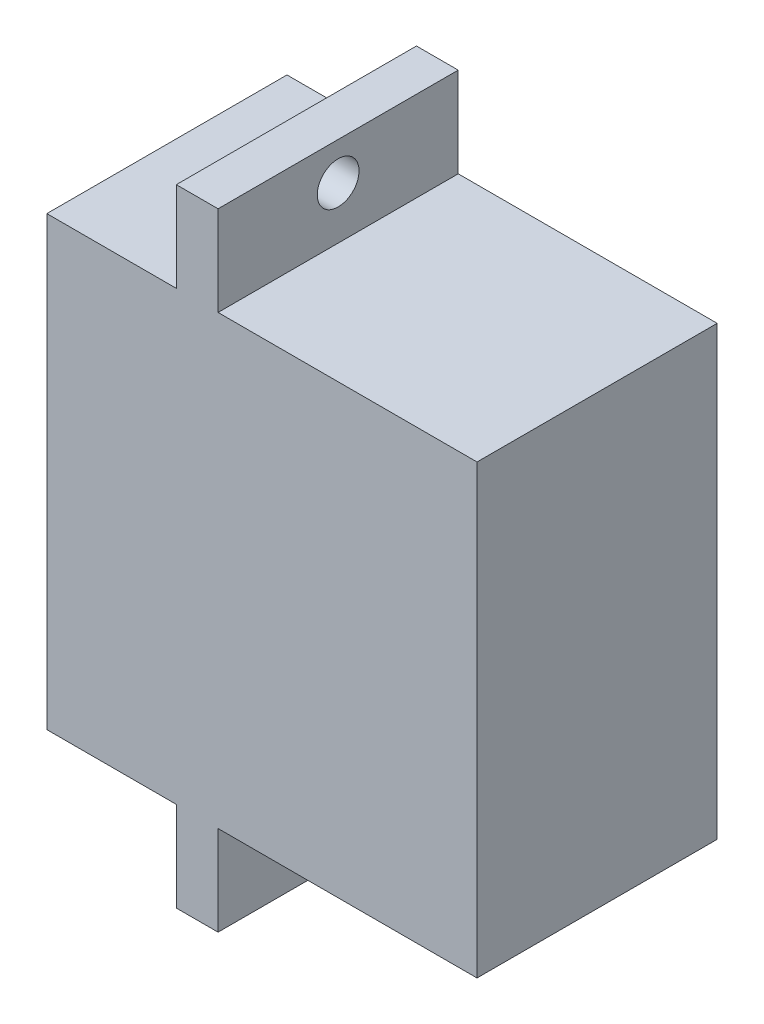
ISO-10303-21;
HEADER;
FILE_DESCRIPTION(('STEP AP214'),'2;1');
FILE_NAME('part.step','',(''),(''),'','','');
FILE_SCHEMA(('AUTOMOTIVE_DESIGN { 1 0 10303 214 1 1 1 1 }'));
ENDSEC;
DATA;
#1=APPLICATION_CONTEXT('core data for automotive mechanical design processes');
#2=APPLICATION_PROTOCOL_DEFINITION('international standard','automotive_design',2000,#1);
#3=PRODUCT_CONTEXT('',#1,'mechanical');
#4=PRODUCT('Part','Part','',(#3));
#5=PRODUCT_RELATED_PRODUCT_CATEGORY('part','',(#4));
#6=PRODUCT_DEFINITION_FORMATION('','',#4);
#7=PRODUCT_DEFINITION_CONTEXT('part definition',#1,'design');
#8=PRODUCT_DEFINITION('design','',#6,#7);
#9=PRODUCT_DEFINITION_SHAPE('','',#8);
#10=(LENGTH_UNIT() NAMED_UNIT(*) SI_UNIT(.MILLI.,.METRE.));
#11=(NAMED_UNIT(*) PLANE_ANGLE_UNIT() SI_UNIT($,.RADIAN.));
#12=(NAMED_UNIT(*) SI_UNIT($,.STERADIAN.) SOLID_ANGLE_UNIT());
#13=UNCERTAINTY_MEASURE_WITH_UNIT(LENGTH_MEASURE(1.E-05),#10,'distance_accuracy_value','');
#14=(GEOMETRIC_REPRESENTATION_CONTEXT(3) GLOBAL_UNCERTAINTY_ASSIGNED_CONTEXT((#13)) GLOBAL_UNIT_ASSIGNED_CONTEXT((#10,
#11,#12)) REPRESENTATION_CONTEXT('',''));
#15=CARTESIAN_POINT('',(0.,0.,0.));
#16=DIRECTION('',(0.,0.,1.));
#17=DIRECTION('',(1.,0.,0.));
#18=AXIS2_PLACEMENT_3D('',#15,#16,#17);
#19=CARTESIAN_POINT('',(50.4,-15.65,2.25));
#20=DIRECTION('',(0.,1.,0.));
#21=DIRECTION('',(0.,0.,1.));
#22=AXIS2_PLACEMENT_3D('',#19,#20,#21);
#23=PLANE('',#22);
#24=DIRECTION('',(0.,0.,1.));
#25=VECTOR('',#24,1.);
#26=CARTESIAN_POINT('',(38.,-15.65,2.25));
#27=LINE('',#26,#25);
#28=CARTESIAN_POINT('',(38.,-15.65,-9.25));
#29=VERTEX_POINT('',#28);
#30=CARTESIAN_POINT('',(38.,-15.65,2.25));
#31=VERTEX_POINT('',#30);
#32=EDGE_CURVE('E134',#29,#31,#27,.T.);
#33=ORIENTED_EDGE('',*,*,#32,.F.);
#34=DIRECTION('',(-1.,0.,0.));
#35=VECTOR('',#34,1.);
#36=CARTESIAN_POINT('',(50.4,-15.65,-9.25));
#37=LINE('',#36,#35);
#38=CARTESIAN_POINT('',(50.4,-15.65,-9.25));
#39=VERTEX_POINT('',#38);
#40=EDGE_CURVE('E190',#39,#29,#37,.T.);
#41=ORIENTED_EDGE('',*,*,#40,.F.);
#42=DIRECTION('',(0.,0.,-1.));
#43=VECTOR('',#42,1.);
#44=CARTESIAN_POINT('',(50.4,-15.65,2.25));
#45=LINE('',#44,#43);
#46=CARTESIAN_POINT('',(50.4,-15.65,2.25));
#47=VERTEX_POINT('',#46);
#48=EDGE_CURVE('E166',#47,#39,#45,.T.);
#49=ORIENTED_EDGE('',*,*,#48,.F.);
#50=DIRECTION('',(-1.,0.,0.));
#51=VECTOR('',#50,1.);
#52=CARTESIAN_POINT('',(50.4,-15.65,2.25));
#53=LINE('',#52,#51);
#54=EDGE_CURVE('E194',#47,#31,#53,.T.);
#55=ORIENTED_EDGE('',*,*,#54,.T.);
#56=EDGE_LOOP('',(#33,#41,#49,#55));
#57=FACE_BOUND('',#56,.T.);
#58=ADVANCED_FACE('F39',(#57),#23,.F.);
#59=CARTESIAN_POINT('',(50.4,5.75,2.25));
#60=DIRECTION('',(0.,-1.,0.));
#61=DIRECTION('',(0.,0.,-1.));
#62=AXIS2_PLACEMENT_3D('',#59,#60,#61);
#63=PLANE('',#62);
#64=DIRECTION('',(0.,0.,-1.));
#65=VECTOR('',#64,1.);
#66=CARTESIAN_POINT('',(38.,5.75,2.25));
#67=LINE('',#66,#65);
#68=CARTESIAN_POINT('',(38.,5.75,2.25));
#69=VERTEX_POINT('',#68);
#70=CARTESIAN_POINT('',(38.,5.75,-9.25));
#71=VERTEX_POINT('',#70);
#72=EDGE_CURVE('E11',#69,#71,#67,.T.);
#73=ORIENTED_EDGE('',*,*,#72,.F.);
#74=DIRECTION('',(-1.,0.,0.));
#75=VECTOR('',#74,1.);
#76=CARTESIAN_POINT('',(50.4,5.75,2.25));
#77=LINE('',#76,#75);
#78=CARTESIAN_POINT('',(50.4,5.75,2.25));
#79=VERTEX_POINT('',#78);
#80=EDGE_CURVE('E184',#79,#69,#77,.T.);
#81=ORIENTED_EDGE('',*,*,#80,.F.);
#82=DIRECTION('',(0.,0.,1.));
#83=VECTOR('',#82,1.);
#84=CARTESIAN_POINT('',(50.4,5.75,2.25));
#85=LINE('',#84,#83);
#86=CARTESIAN_POINT('',(50.4,5.75,-9.25));
#87=VERTEX_POINT('',#86);
#88=EDGE_CURVE('E171',#87,#79,#85,.T.);
#89=ORIENTED_EDGE('',*,*,#88,.F.);
#90=DIRECTION('',(-1.,0.,0.));
#91=VECTOR('',#90,1.);
#92=CARTESIAN_POINT('',(50.4,5.75,-9.25));
#93=LINE('',#92,#91);
#94=EDGE_CURVE('E62',#87,#71,#93,.T.);
#95=ORIENTED_EDGE('',*,*,#94,.T.);
#96=EDGE_LOOP('',(#73,#81,#89,#95));
#97=FACE_BOUND('',#96,.T.);
#98=ADVANCED_FACE('F246',(#97),#63,.F.);
#99=CARTESIAN_POINT('',(50.4,-15.65,2.25));
#100=DIRECTION('',(0.,0.,-1.));
#101=DIRECTION('',(-1.,0.,0.));
#102=AXIS2_PLACEMENT_3D('',#99,#100,#101);
#103=PLANE('',#102);
#104=CARTESIAN_POINT('',(36.,-15.65,2.25));
#105=VERTEX_POINT('',#104);
#106=CARTESIAN_POINT('',(29.8,-15.65,2.25));
#107=VERTEX_POINT('',#106);
#108=EDGE_CURVE('E193',#105,#107,#53,.T.);
#109=ORIENTED_EDGE('',*,*,#108,.F.);
#110=DIRECTION('',(0.,-1.,0.));
#111=VECTOR('',#110,1.);
#112=CARTESIAN_POINT('',(36.,-19.95,2.25));
#113=LINE('',#112,#111);
#114=CARTESIAN_POINT('',(36.,-19.95,2.25));
#115=VERTEX_POINT('',#114);
#116=EDGE_CURVE('E151',#105,#115,#113,.T.);
#117=ORIENTED_EDGE('',*,*,#116,.T.);
#118=DIRECTION('',(-1.,0.,0.));
#119=VECTOR('',#118,1.);
#120=CARTESIAN_POINT('',(38.,-19.95,2.25));
#121=LINE('',#120,#119);
#122=CARTESIAN_POINT('',(38.,-19.95,2.25));
#123=VERTEX_POINT('',#122);
#124=EDGE_CURVE('E145',#123,#115,#121,.T.);
#125=ORIENTED_EDGE('',*,*,#124,.F.);
#126=DIRECTION('',(0.,-1.,0.));
#127=VECTOR('',#126,1.);
#128=CARTESIAN_POINT('',(38.,-19.95,2.25));
#129=LINE('',#128,#127);
#130=EDGE_CURVE('E128',#31,#123,#129,.T.);
#131=ORIENTED_EDGE('',*,*,#130,.F.);
#132=ORIENTED_EDGE('',*,*,#54,.F.);
#133=DIRECTION('',(0.,-1.,0.));
#134=VECTOR('',#133,1.);
#135=CARTESIAN_POINT('',(50.4,-15.65,2.25));
#136=LINE('',#135,#134);
#137=EDGE_CURVE('E163',#79,#47,#136,.T.);
#138=ORIENTED_EDGE('',*,*,#137,.F.);
#139=ORIENTED_EDGE('',*,*,#80,.T.);
#140=CARTESIAN_POINT('',(38.,10.05,2.25));
#141=VERTEX_POINT('',#140);
#142=EDGE_CURVE('E139',#141,#69,#129,.T.);
#143=ORIENTED_EDGE('',*,*,#142,.F.);
#144=DIRECTION('',(-1.,0.,0.));
#145=VECTOR('',#144,1.);
#146=CARTESIAN_POINT('',(38.,10.05,2.25));
#147=LINE('',#146,#145);
#148=CARTESIAN_POINT('',(36.,10.05,2.25));
#149=VERTEX_POINT('',#148);
#150=EDGE_CURVE('E215',#141,#149,#147,.T.);
#151=ORIENTED_EDGE('',*,*,#150,.T.);
#152=CARTESIAN_POINT('',(36.,5.75,2.25));
#153=VERTEX_POINT('',#152);
#154=EDGE_CURVE('E210',#149,#153,#113,.T.);
#155=ORIENTED_EDGE('',*,*,#154,.T.);
#156=CARTESIAN_POINT('',(29.8,5.75,2.25));
#157=VERTEX_POINT('',#156);
#158=EDGE_CURVE('E173',#153,#157,#77,.T.);
#159=ORIENTED_EDGE('',*,*,#158,.T.);
#160=DIRECTION('',(0.,-1.,0.));
#161=VECTOR('',#160,1.);
#162=CARTESIAN_POINT('',(29.8,-15.65,2.25));
#163=LINE('',#162,#161);
#164=EDGE_CURVE('E162',#157,#107,#163,.T.);
#165=ORIENTED_EDGE('',*,*,#164,.T.);
#166=EDGE_LOOP('',(#109,#117,#125,#131,#132,#138,#139,#143,#151,#155,#159,#165));
#167=FACE_BOUND('',#166,.T.);
#168=ADVANCED_FACE('F41',(#167),#103,.F.);
#169=CARTESIAN_POINT('',(36.,-15.65,-9.25));
#170=VERTEX_POINT('',#169);
#171=CARTESIAN_POINT('',(29.8,-15.65,-9.25));
#172=VERTEX_POINT('',#171);
#173=EDGE_CURVE('E189',#170,#172,#37,.T.);
#174=ORIENTED_EDGE('',*,*,#173,.F.);
#175=DIRECTION('',(0.,0.,1.));
#176=VECTOR('',#175,1.);
#177=CARTESIAN_POINT('',(36.,-15.65,2.25));
#178=LINE('',#177,#176);
#179=EDGE_CURVE('E153',#170,#105,#178,.T.);
#180=ORIENTED_EDGE('',*,*,#179,.T.);
#181=ORIENTED_EDGE('',*,*,#108,.T.);
#182=DIRECTION('',(0.,0.,-1.));
#183=VECTOR('',#182,1.);
#184=CARTESIAN_POINT('',(29.8,-15.65,2.25));
#185=LINE('',#184,#183);
#186=EDGE_CURVE('E176',#107,#172,#185,.T.);
#187=ORIENTED_EDGE('',*,*,#186,.T.);
#188=EDGE_LOOP('',(#174,#180,#181,#187));
#189=FACE_BOUND('',#188,.T.);
#190=ADVANCED_FACE('F252',(#189),#23,.F.);
#191=CARTESIAN_POINT('',(50.4,-15.65,-9.25));
#192=DIRECTION('',(0.,0.,1.));
#193=DIRECTION('',(1.,0.,0.));
#194=AXIS2_PLACEMENT_3D('',#191,#192,#193);
#195=PLANE('',#194);
#196=CARTESIAN_POINT('',(36.,5.75,-9.25));
#197=VERTEX_POINT('',#196);
#198=CARTESIAN_POINT('',(29.8,5.75,-9.25));
#199=VERTEX_POINT('',#198);
#200=EDGE_CURVE('E187',#197,#199,#93,.T.);
#201=ORIENTED_EDGE('',*,*,#200,.F.);
#202=DIRECTION('',(0.,1.,0.));
#203=VECTOR('',#202,1.);
#204=CARTESIAN_POINT('',(36.,-19.95,-9.25));
#205=LINE('',#204,#203);
#206=CARTESIAN_POINT('',(36.,10.05,-9.25));
#207=VERTEX_POINT('',#206);
#208=EDGE_CURVE('E204',#197,#207,#205,.T.);
#209=ORIENTED_EDGE('',*,*,#208,.T.);
#210=DIRECTION('',(-1.,0.,0.));
#211=VECTOR('',#210,1.);
#212=CARTESIAN_POINT('',(38.,10.05,-9.25));
#213=LINE('',#212,#211);
#214=CARTESIAN_POINT('',(38.,10.05,-9.25));
#215=VERTEX_POINT('',#214);
#216=EDGE_CURVE('E157',#215,#207,#213,.T.);
#217=ORIENTED_EDGE('',*,*,#216,.F.);
#218=DIRECTION('',(0.,1.,0.));
#219=VECTOR('',#218,1.);
#220=CARTESIAN_POINT('',(38.,-19.95,-9.25));
#221=LINE('',#220,#219);
#222=EDGE_CURVE('E148',#71,#215,#221,.T.);
#223=ORIENTED_EDGE('',*,*,#222,.F.);
#224=ORIENTED_EDGE('',*,*,#94,.F.);
#225=DIRECTION('',(0.,1.,0.));
#226=VECTOR('',#225,1.);
#227=CARTESIAN_POINT('',(50.4,-15.65,-9.25));
#228=LINE('',#227,#226);
#229=EDGE_CURVE('E169',#39,#87,#228,.T.);
#230=ORIENTED_EDGE('',*,*,#229,.F.);
#231=ORIENTED_EDGE('',*,*,#40,.T.);
#232=CARTESIAN_POINT('',(38.,-19.95,-9.25));
#233=VERTEX_POINT('',#232);
#234=EDGE_CURVE('E226',#233,#29,#221,.T.);
#235=ORIENTED_EDGE('',*,*,#234,.F.);
#236=DIRECTION('',(-1.,0.,0.));
#237=VECTOR('',#236,1.);
#238=CARTESIAN_POINT('',(38.,-19.95,-9.25));
#239=LINE('',#238,#237);
#240=CARTESIAN_POINT('',(36.,-19.95,-9.25));
#241=VERTEX_POINT('',#240);
#242=EDGE_CURVE('E146',#233,#241,#239,.T.);
#243=ORIENTED_EDGE('',*,*,#242,.T.);
#244=EDGE_CURVE('E54',#241,#170,#205,.T.);
#245=ORIENTED_EDGE('',*,*,#244,.T.);
#246=ORIENTED_EDGE('',*,*,#173,.T.);
#247=DIRECTION('',(0.,1.,0.));
#248=VECTOR('',#247,1.);
#249=CARTESIAN_POINT('',(29.8,-15.65,-9.25));
#250=LINE('',#249,#248);
#251=EDGE_CURVE('E179',#172,#199,#250,.T.);
#252=ORIENTED_EDGE('',*,*,#251,.T.);
#253=EDGE_LOOP('',(#201,#209,#217,#223,#224,#230,#231,#235,#243,#245,#246,#252));
#254=FACE_BOUND('',#253,.T.);
#255=ADVANCED_FACE('F223',(#254),#195,.F.);
#256=ORIENTED_EDGE('',*,*,#158,.F.);
#257=DIRECTION('',(0.,0.,-1.));
#258=VECTOR('',#257,1.);
#259=CARTESIAN_POINT('',(36.,5.75,2.25));
#260=LINE('',#259,#258);
#261=EDGE_CURVE('E47',#153,#197,#260,.T.);
#262=ORIENTED_EDGE('',*,*,#261,.T.);
#263=ORIENTED_EDGE('',*,*,#200,.T.);
#264=DIRECTION('',(0.,0.,1.));
#265=VECTOR('',#264,1.);
#266=CARTESIAN_POINT('',(29.8,5.75,2.25));
#267=LINE('',#266,#265);
#268=EDGE_CURVE('E167',#199,#157,#267,.T.);
#269=ORIENTED_EDGE('',*,*,#268,.T.);
#270=EDGE_LOOP('',(#256,#262,#263,#269));
#271=FACE_BOUND('',#270,.T.);
#272=ADVANCED_FACE('F199',(#271),#63,.F.);
#273=CARTESIAN_POINT('',(50.4,0.,0.));
#274=DIRECTION('',(-1.,0.,0.));
#275=DIRECTION('',(0.,0.,1.));
#276=AXIS2_PLACEMENT_3D('',#273,#274,#275);
#277=PLANE('',#276);
#278=ORIENTED_EDGE('',*,*,#137,.T.);
#279=ORIENTED_EDGE('',*,*,#48,.T.);
#280=ORIENTED_EDGE('',*,*,#229,.T.);
#281=ORIENTED_EDGE('',*,*,#88,.T.);
#282=EDGE_LOOP('',(#278,#279,#280,#281));
#283=FACE_BOUND('',#282,.T.);
#284=ADVANCED_FACE('F248',(#283),#277,.F.);
#285=CARTESIAN_POINT('',(29.8,0.,0.));
#286=DIRECTION('',(-1.,0.,0.));
#287=DIRECTION('',(0.,0.,1.));
#288=AXIS2_PLACEMENT_3D('',#285,#286,#287);
#289=PLANE('',#288);
#290=CARTESIAN_POINT('',(29.8,0.,-3.5));
#291=DIRECTION('',(1.,0.,0.));
#292=DIRECTION('',(0.,0.,-1.));
#293=AXIS2_PLACEMENT_3D('',#290,#291,#292);
#294=CIRCLE('',#293,2.5);
#295=CARTESIAN_POINT('',(29.8,0.,-6.));
#296=VERTEX_POINT('',#295);
#297=EDGE_CURVE('E376',#296,#296,#294,.T.);
#298=ORIENTED_EDGE('',*,*,#297,.T.);
#299=EDGE_LOOP('',(#298));
#300=FACE_BOUND('',#299,.T.);
#301=ORIENTED_EDGE('',*,*,#164,.F.);
#302=ORIENTED_EDGE('',*,*,#268,.F.);
#303=ORIENTED_EDGE('',*,*,#251,.F.);
#304=ORIENTED_EDGE('',*,*,#186,.F.);
#305=EDGE_LOOP('',(#301,#302,#303,#304));
#306=FACE_BOUND('',#305,.T.);
#307=ADVANCED_FACE('F271',(#300,#306),#289,.T.);
#308=CARTESIAN_POINT('',(38.,8.25,-3.5));
#309=DIRECTION('',(-1.,0.,0.));
#310=DIRECTION('',(0.,0.,1.));
#311=AXIS2_PLACEMENT_3D('',#308,#309,#310);
#312=CYLINDRICAL_SURFACE('',#311,1.);
#313=CARTESIAN_POINT('',(38.,8.25,-3.5));
#314=DIRECTION('',(1.,0.,0.));
#315=DIRECTION('',(0.,0.,-1.));
#316=AXIS2_PLACEMENT_3D('',#313,#314,#315);
#317=CIRCLE('',#316,1.);
#318=CARTESIAN_POINT('',(38.,8.25,-4.5));
#319=VERTEX_POINT('',#318);
#320=EDGE_CURVE('E236',#319,#319,#317,.T.);
#321=ORIENTED_EDGE('',*,*,#320,.T.);
#322=EDGE_LOOP('',(#321));
#323=FACE_BOUND('',#322,.T.);
#324=CARTESIAN_POINT('',(36.,8.25,-3.5));
#325=DIRECTION('',(1.,0.,0.));
#326=DIRECTION('',(0.,0.,-1.));
#327=AXIS2_PLACEMENT_3D('',#324,#325,#326);
#328=CIRCLE('',#327,1.);
#329=CARTESIAN_POINT('',(36.,8.25,-4.5));
#330=VERTEX_POINT('',#329);
#331=EDGE_CURVE('E239',#330,#330,#328,.T.);
#332=ORIENTED_EDGE('',*,*,#331,.F.);
#333=EDGE_LOOP('',(#332));
#334=FACE_BOUND('',#333,.T.);
#335=ADVANCED_FACE('F273',(#323,#334),#312,.F.);
#336=CARTESIAN_POINT('',(38.,10.05,2.25));
#337=DIRECTION('',(0.,-1.,0.));
#338=DIRECTION('',(0.,0.,-1.));
#339=AXIS2_PLACEMENT_3D('',#336,#337,#338);
#340=PLANE('',#339);
#341=DIRECTION('',(0.,0.,1.));
#342=VECTOR('',#341,1.);
#343=CARTESIAN_POINT('',(36.,10.05,2.25));
#344=LINE('',#343,#342);
#345=EDGE_CURVE('E140',#207,#149,#344,.T.);
#346=ORIENTED_EDGE('',*,*,#345,.T.);
#347=ORIENTED_EDGE('',*,*,#150,.F.);
#348=DIRECTION('',(0.,0.,1.));
#349=VECTOR('',#348,1.);
#350=CARTESIAN_POINT('',(38.,10.05,2.25));
#351=LINE('',#350,#349);
#352=EDGE_CURVE('E217',#215,#141,#351,.T.);
#353=ORIENTED_EDGE('',*,*,#352,.F.);
#354=ORIENTED_EDGE('',*,*,#216,.T.);
#355=EDGE_LOOP('',(#346,#347,#353,#354));
#356=FACE_BOUND('',#355,.T.);
#357=ADVANCED_FACE('F220',(#356),#340,.F.);
#358=CARTESIAN_POINT('',(36.,0.,0.));
#359=DIRECTION('',(-1.,0.,0.));
#360=DIRECTION('',(0.,0.,1.));
#361=AXIS2_PLACEMENT_3D('',#358,#359,#360);
#362=PLANE('',#361);
#363=ORIENTED_EDGE('',*,*,#331,.T.);
#364=EDGE_LOOP('',(#363));
#365=FACE_BOUND('',#364,.T.);
#366=ORIENTED_EDGE('',*,*,#261,.F.);
#367=ORIENTED_EDGE('',*,*,#154,.F.);
#368=ORIENTED_EDGE('',*,*,#345,.F.);
#369=ORIENTED_EDGE('',*,*,#208,.F.);
#370=EDGE_LOOP('',(#366,#367,#368,#369));
#371=FACE_BOUND('',#370,.T.);
#372=ADVANCED_FACE('F205',(#365,#371),#362,.T.);
#373=CARTESIAN_POINT('',(38.,0.,0.));
#374=DIRECTION('',(-1.,0.,0.));
#375=DIRECTION('',(0.,0.,1.));
#376=AXIS2_PLACEMENT_3D('',#373,#374,#375);
#377=PLANE('',#376);
#378=ORIENTED_EDGE('',*,*,#320,.F.);
#379=EDGE_LOOP('',(#378));
#380=FACE_BOUND('',#379,.T.);
#381=ORIENTED_EDGE('',*,*,#142,.T.);
#382=ORIENTED_EDGE('',*,*,#72,.T.);
#383=ORIENTED_EDGE('',*,*,#222,.T.);
#384=ORIENTED_EDGE('',*,*,#352,.T.);
#385=EDGE_LOOP('',(#381,#382,#383,#384));
#386=FACE_BOUND('',#385,.T.);
#387=ADVANCED_FACE('F243',(#380,#386),#377,.F.);
#388=CARTESIAN_POINT('',(38.,-18.15,-3.5));
#389=DIRECTION('',(1.,0.,0.));
#390=DIRECTION('',(0.,0.,-1.));
#391=AXIS2_PLACEMENT_3D('',#388,#389,#390);
#392=CIRCLE('',#391,1.);
#393=CARTESIAN_POINT('',(38.,-18.15,-4.5));
#394=VERTEX_POINT('',#393);
#395=EDGE_CURVE('E229',#394,#394,#392,.T.);
#396=ORIENTED_EDGE('',*,*,#395,.F.);
#397=EDGE_LOOP('',(#396));
#398=FACE_BOUND('',#397,.T.);
#399=ORIENTED_EDGE('',*,*,#234,.T.);
#400=ORIENTED_EDGE('',*,*,#32,.T.);
#401=ORIENTED_EDGE('',*,*,#130,.T.);
#402=DIRECTION('',(0.,0.,-1.));
#403=VECTOR('',#402,1.);
#404=CARTESIAN_POINT('',(38.,-19.95,2.25));
#405=LINE('',#404,#403);
#406=EDGE_CURVE('E131',#123,#233,#405,.T.);
#407=ORIENTED_EDGE('',*,*,#406,.T.);
#408=EDGE_LOOP('',(#399,#400,#401,#407));
#409=FACE_BOUND('',#408,.T.);
#410=ADVANCED_FACE('F130',(#398,#409),#377,.F.);
#411=CARTESIAN_POINT('',(36.,-18.15,-3.5));
#412=DIRECTION('',(1.,0.,0.));
#413=DIRECTION('',(0.,0.,-1.));
#414=AXIS2_PLACEMENT_3D('',#411,#412,#413);
#415=CIRCLE('',#414,1.);
#416=CARTESIAN_POINT('',(36.,-18.15,-4.5));
#417=VERTEX_POINT('',#416);
#418=EDGE_CURVE('E231',#417,#417,#415,.T.);
#419=ORIENTED_EDGE('',*,*,#418,.T.);
#420=EDGE_LOOP('',(#419));
#421=FACE_BOUND('',#420,.T.);
#422=ORIENTED_EDGE('',*,*,#179,.F.);
#423=ORIENTED_EDGE('',*,*,#244,.F.);
#424=DIRECTION('',(0.,0.,-1.));
#425=VECTOR('',#424,1.);
#426=CARTESIAN_POINT('',(36.,-19.95,2.25));
#427=LINE('',#426,#425);
#428=EDGE_CURVE('E208',#115,#241,#427,.T.);
#429=ORIENTED_EDGE('',*,*,#428,.F.);
#430=ORIENTED_EDGE('',*,*,#116,.F.);
#431=EDGE_LOOP('',(#422,#423,#429,#430));
#432=FACE_BOUND('',#431,.T.);
#433=ADVANCED_FACE('F314',(#421,#432),#362,.T.);
#434=CARTESIAN_POINT('',(38.,-19.95,2.25));
#435=DIRECTION('',(0.,1.,0.));
#436=DIRECTION('',(0.,0.,1.));
#437=AXIS2_PLACEMENT_3D('',#434,#435,#436);
#438=PLANE('',#437);
#439=ORIENTED_EDGE('',*,*,#428,.T.);
#440=ORIENTED_EDGE('',*,*,#242,.F.);
#441=ORIENTED_EDGE('',*,*,#406,.F.);
#442=ORIENTED_EDGE('',*,*,#124,.T.);
#443=EDGE_LOOP('',(#439,#440,#441,#442));
#444=FACE_BOUND('',#443,.T.);
#445=ADVANCED_FACE('F144',(#444),#438,.F.);
#446=CARTESIAN_POINT('',(38.,-18.15,-3.5));
#447=DIRECTION('',(-1.,0.,0.));
#448=DIRECTION('',(0.,0.,1.));
#449=AXIS2_PLACEMENT_3D('',#446,#447,#448);
#450=CYLINDRICAL_SURFACE('',#449,1.);
#451=ORIENTED_EDGE('',*,*,#395,.T.);
#452=EDGE_LOOP('',(#451));
#453=FACE_BOUND('',#452,.T.);
#454=ORIENTED_EDGE('',*,*,#418,.F.);
#455=EDGE_LOOP('',(#454));
#456=FACE_BOUND('',#455,.T.);
#457=ADVANCED_FACE('F342',(#453,#456),#450,.F.);
#458=CARTESIAN_POINT('',(29.8,0.,-3.5));
#459=DIRECTION('',(-1.,0.,0.));
#460=DIRECTION('',(0.,0.,1.));
#461=AXIS2_PLACEMENT_3D('',#458,#459,#460);
#462=CYLINDRICAL_SURFACE('',#461,2.5);
#463=ORIENTED_EDGE('',*,*,#297,.F.);
#464=EDGE_LOOP('',(#463));
#465=FACE_BOUND('',#464,.T.);
#466=CARTESIAN_POINT('',(27.,0.,-3.5));
#467=DIRECTION('',(1.,0.,0.));
#468=DIRECTION('',(0.,0.,-1.));
#469=AXIS2_PLACEMENT_3D('',#466,#467,#468);
#470=CIRCLE('',#469,2.5);
#471=CARTESIAN_POINT('',(27.,0.,-6.));
#472=VERTEX_POINT('',#471);
#473=EDGE_CURVE('E374',#472,#472,#470,.T.);
#474=ORIENTED_EDGE('',*,*,#473,.T.);
#475=EDGE_LOOP('',(#474));
#476=FACE_BOUND('',#475,.T.);
#477=ADVANCED_FACE('F348',(#465,#476),#462,.T.);
#478=CARTESIAN_POINT('',(27.,0.,-3.5));
#479=DIRECTION('',(1.,0.,0.));
#480=DIRECTION('',(0.,0.,-1.));
#481=AXIS2_PLACEMENT_3D('',#478,#479,#480);
#482=PLANE('',#481);
#483=ORIENTED_EDGE('',*,*,#473,.F.);
#484=EDGE_LOOP('',(#483));
#485=FACE_BOUND('',#484,.T.);
#486=ADVANCED_FACE('F359',(#485),#482,.F.);
#487=CLOSED_SHELL('',(#58,#98,#168,#190,#255,#272,#284,#307,#335,#357,#372,#387,#410,#433,#445,
#457,#477,#486));
#488=MANIFOLD_SOLID_BREP('B2',#487);
#489=ADVANCED_BREP_SHAPE_REPRESENTATION('',(#18,#488),#14);
#490=SHAPE_DEFINITION_REPRESENTATION(#9,#489);
ENDSEC;
END-ISO-10303-21;
